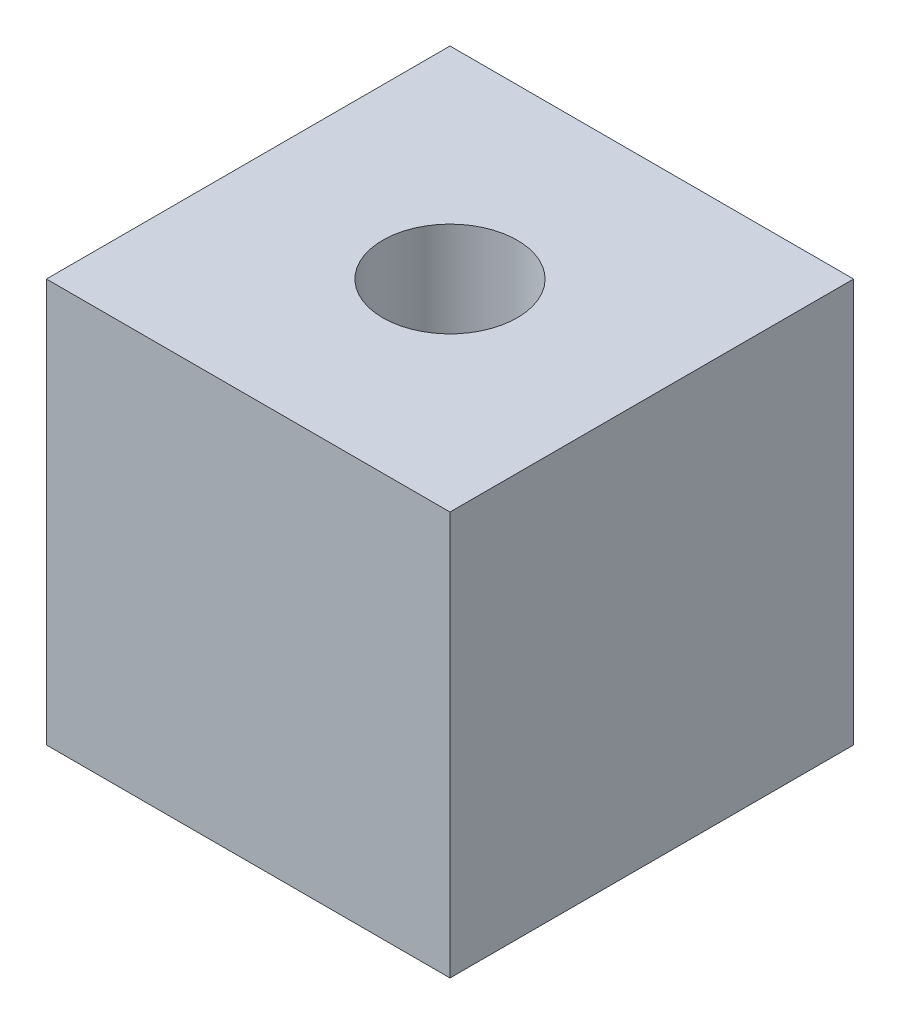
ISO-10303-21;
HEADER;
FILE_DESCRIPTION(('STEP AP214'),'2;1');
FILE_NAME('part.step','',(''),(''),'','','');
FILE_SCHEMA(('AUTOMOTIVE_DESIGN { 1 0 10303 214 1 1 1 1 }'));
ENDSEC;
DATA;
#1=APPLICATION_CONTEXT('core data for automotive mechanical design processes');
#2=APPLICATION_PROTOCOL_DEFINITION('international standard','automotive_design',2000,#1);
#3=PRODUCT_CONTEXT('',#1,'mechanical');
#4=PRODUCT('Part','Part','',(#3));
#5=PRODUCT_RELATED_PRODUCT_CATEGORY('part','',(#4));
#6=PRODUCT_DEFINITION_FORMATION('','',#4);
#7=PRODUCT_DEFINITION_CONTEXT('part definition',#1,'design');
#8=PRODUCT_DEFINITION('design','',#6,#7);
#9=PRODUCT_DEFINITION_SHAPE('','',#8);
#10=(LENGTH_UNIT() NAMED_UNIT(*) SI_UNIT(.MILLI.,.METRE.));
#11=(NAMED_UNIT(*) PLANE_ANGLE_UNIT() SI_UNIT($,.RADIAN.));
#12=(NAMED_UNIT(*) SI_UNIT($,.STERADIAN.) SOLID_ANGLE_UNIT());
#13=UNCERTAINTY_MEASURE_WITH_UNIT(LENGTH_MEASURE(1.E-05),#10,'distance_accuracy_value','');
#14=(GEOMETRIC_REPRESENTATION_CONTEXT(3) GLOBAL_UNCERTAINTY_ASSIGNED_CONTEXT((#13)) GLOBAL_UNIT_ASSIGNED_CONTEXT((#10,
#11,#12)) REPRESENTATION_CONTEXT('',''));
#15=CARTESIAN_POINT('',(0.,0.,0.));
#16=DIRECTION('',(0.,0.,1.));
#17=DIRECTION('',(1.,0.,0.));
#18=AXIS2_PLACEMENT_3D('',#15,#16,#17);
#19=CARTESIAN_POINT('',(0.,12.,0.));
#20=DIRECTION('',(0.,1.,0.));
#21=DIRECTION('',(0.,0.,1.));
#22=AXIS2_PLACEMENT_3D('',#19,#20,#21);
#23=PLANE('',#22);
#24=DIRECTION('',(0.,0.,1.));
#25=VECTOR('',#24,1.);
#26=CARTESIAN_POINT('',(0.,12.,0.));
#27=LINE('',#26,#25);
#28=CARTESIAN_POINT('',(0.,12.,0.));
#29=VERTEX_POINT('',#28);
#30=CARTESIAN_POINT('',(0.,12.,12.));
#31=VERTEX_POINT('',#30);
#32=EDGE_CURVE('E85',#29,#31,#27,.T.);
#33=ORIENTED_EDGE('',*,*,#32,.T.);
#34=DIRECTION('',(1.,0.,0.));
#35=VECTOR('',#34,1.);
#36=CARTESIAN_POINT('',(0.,12.,12.));
#37=LINE('',#36,#35);
#38=CARTESIAN_POINT('',(12.,12.,12.));
#39=VERTEX_POINT('',#38);
#40=EDGE_CURVE('E80',#31,#39,#37,.T.);
#41=ORIENTED_EDGE('',*,*,#40,.T.);
#42=DIRECTION('',(0.,0.,-1.));
#43=VECTOR('',#42,1.);
#44=CARTESIAN_POINT('',(12.,12.,0.));
#45=LINE('',#44,#43);
#46=CARTESIAN_POINT('',(12.,12.,0.));
#47=VERTEX_POINT('',#46);
#48=EDGE_CURVE('E83',#39,#47,#45,.T.);
#49=ORIENTED_EDGE('',*,*,#48,.T.);
#50=DIRECTION('',(-1.,0.,0.));
#51=VECTOR('',#50,1.);
#52=CARTESIAN_POINT('',(0.,12.,0.));
#53=LINE('',#52,#51);
#54=EDGE_CURVE('E50',#47,#29,#53,.T.);
#55=ORIENTED_EDGE('',*,*,#54,.T.);
#56=EDGE_LOOP('',(#33,#41,#49,#55));
#57=FACE_BOUND('',#56,.T.);
#58=CARTESIAN_POINT('',(6.,12.,6.));
#59=DIRECTION('',(0.,1.,0.));
#60=DIRECTION('',(0.,0.,1.));
#61=AXIS2_PLACEMENT_3D('',#58,#59,#60);
#62=CIRCLE('',#61,2.);
#63=CARTESIAN_POINT('',(6.,12.,8.));
#64=VERTEX_POINT('',#63);
#65=EDGE_CURVE('E100',#64,#64,#62,.T.);
#66=ORIENTED_EDGE('',*,*,#65,.F.);
#67=EDGE_LOOP('',(#66));
#68=FACE_BOUND('',#67,.T.);
#69=ADVANCED_FACE('F33',(#57,#68),#23,.T.);
#70=CARTESIAN_POINT('',(0.,0.,0.));
#71=DIRECTION('',(0.,1.,0.));
#72=DIRECTION('',(0.,0.,1.));
#73=AXIS2_PLACEMENT_3D('',#70,#71,#72);
#74=PLANE('',#73);
#75=DIRECTION('',(0.,0.,1.));
#76=VECTOR('',#75,1.);
#77=CARTESIAN_POINT('',(0.,0.,0.));
#78=LINE('',#77,#76);
#79=CARTESIAN_POINT('',(0.,0.,0.));
#80=VERTEX_POINT('',#79);
#81=CARTESIAN_POINT('',(0.,0.,12.));
#82=VERTEX_POINT('',#81);
#83=EDGE_CURVE('E97',#80,#82,#78,.T.);
#84=ORIENTED_EDGE('',*,*,#83,.F.);
#85=DIRECTION('',(-1.,0.,0.));
#86=VECTOR('',#85,1.);
#87=CARTESIAN_POINT('',(0.,0.,0.));
#88=LINE('',#87,#86);
#89=CARTESIAN_POINT('',(12.,0.,0.));
#90=VERTEX_POINT('',#89);
#91=EDGE_CURVE('E73',#90,#80,#88,.T.);
#92=ORIENTED_EDGE('',*,*,#91,.F.);
#93=DIRECTION('',(0.,0.,-1.));
#94=VECTOR('',#93,1.);
#95=CARTESIAN_POINT('',(12.,0.,0.));
#96=LINE('',#95,#94);
#97=CARTESIAN_POINT('',(12.,0.,12.));
#98=VERTEX_POINT('',#97);
#99=EDGE_CURVE('E67',#98,#90,#96,.T.);
#100=ORIENTED_EDGE('',*,*,#99,.F.);
#101=DIRECTION('',(1.,0.,0.));
#102=VECTOR('',#101,1.);
#103=CARTESIAN_POINT('',(0.,0.,12.));
#104=LINE('',#103,#102);
#105=EDGE_CURVE('E89',#82,#98,#104,.T.);
#106=ORIENTED_EDGE('',*,*,#105,.F.);
#107=EDGE_LOOP('',(#84,#92,#100,#106));
#108=FACE_BOUND('',#107,.T.);
#109=CARTESIAN_POINT('',(6.,0.,6.));
#110=DIRECTION('',(0.,1.,0.));
#111=DIRECTION('',(0.,0.,1.));
#112=AXIS2_PLACEMENT_3D('',#109,#110,#111);
#113=CIRCLE('',#112,2.);
#114=CARTESIAN_POINT('',(6.,0.,8.));
#115=VERTEX_POINT('',#114);
#116=EDGE_CURVE('E112',#115,#115,#113,.T.);
#117=ORIENTED_EDGE('',*,*,#116,.T.);
#118=EDGE_LOOP('',(#117));
#119=FACE_BOUND('',#118,.T.);
#120=ADVANCED_FACE('F108',(#108,#119),#74,.F.);
#121=CARTESIAN_POINT('',(0.,12.,0.));
#122=DIRECTION('',(1.,0.,0.));
#123=DIRECTION('',(0.,0.,-1.));
#124=AXIS2_PLACEMENT_3D('',#121,#122,#123);
#125=PLANE('',#124);
#126=ORIENTED_EDGE('',*,*,#83,.T.);
#127=DIRECTION('',(0.,-1.,0.));
#128=VECTOR('',#127,1.);
#129=CARTESIAN_POINT('',(0.,12.,12.));
#130=LINE('',#129,#128);
#131=EDGE_CURVE('E11',#31,#82,#130,.T.);
#132=ORIENTED_EDGE('',*,*,#131,.F.);
#133=ORIENTED_EDGE('',*,*,#32,.F.);
#134=DIRECTION('',(0.,-1.,0.));
#135=VECTOR('',#134,1.);
#136=CARTESIAN_POINT('',(0.,12.,0.));
#137=LINE('',#136,#135);
#138=EDGE_CURVE('E93',#29,#80,#137,.T.);
#139=ORIENTED_EDGE('',*,*,#138,.T.);
#140=EDGE_LOOP('',(#126,#132,#133,#139));
#141=FACE_BOUND('',#140,.T.);
#142=ADVANCED_FACE('F35',(#141),#125,.F.);
#143=CARTESIAN_POINT('',(0.,12.,12.));
#144=DIRECTION('',(0.,0.,-1.));
#145=DIRECTION('',(-1.,0.,0.));
#146=AXIS2_PLACEMENT_3D('',#143,#144,#145);
#147=PLANE('',#146);
#148=ORIENTED_EDGE('',*,*,#105,.T.);
#149=DIRECTION('',(0.,-1.,0.));
#150=VECTOR('',#149,1.);
#151=CARTESIAN_POINT('',(12.,12.,12.));
#152=LINE('',#151,#150);
#153=EDGE_CURVE('E42',#39,#98,#152,.T.);
#154=ORIENTED_EDGE('',*,*,#153,.F.);
#155=ORIENTED_EDGE('',*,*,#40,.F.);
#156=ORIENTED_EDGE('',*,*,#131,.T.);
#157=EDGE_LOOP('',(#148,#154,#155,#156));
#158=FACE_BOUND('',#157,.T.);
#159=ADVANCED_FACE('F88',(#158),#147,.F.);
#160=CARTESIAN_POINT('',(12.,12.,0.));
#161=DIRECTION('',(-1.,0.,0.));
#162=DIRECTION('',(0.,0.,1.));
#163=AXIS2_PLACEMENT_3D('',#160,#161,#162);
#164=PLANE('',#163);
#165=ORIENTED_EDGE('',*,*,#99,.T.);
#166=DIRECTION('',(0.,-1.,0.));
#167=VECTOR('',#166,1.);
#168=CARTESIAN_POINT('',(12.,12.,0.));
#169=LINE('',#168,#167);
#170=EDGE_CURVE('E90',#47,#90,#169,.T.);
#171=ORIENTED_EDGE('',*,*,#170,.F.);
#172=ORIENTED_EDGE('',*,*,#48,.F.);
#173=ORIENTED_EDGE('',*,*,#153,.T.);
#174=EDGE_LOOP('',(#165,#171,#172,#173));
#175=FACE_BOUND('',#174,.T.);
#176=ADVANCED_FACE('F91',(#175),#164,.F.);
#177=CARTESIAN_POINT('',(0.,12.,0.));
#178=DIRECTION('',(0.,0.,1.));
#179=DIRECTION('',(1.,0.,0.));
#180=AXIS2_PLACEMENT_3D('',#177,#178,#179);
#181=PLANE('',#180);
#182=ORIENTED_EDGE('',*,*,#91,.T.);
#183=ORIENTED_EDGE('',*,*,#138,.F.);
#184=ORIENTED_EDGE('',*,*,#54,.F.);
#185=ORIENTED_EDGE('',*,*,#170,.T.);
#186=EDGE_LOOP('',(#182,#183,#184,#185));
#187=FACE_BOUND('',#186,.T.);
#188=ADVANCED_FACE('F105',(#187),#181,.F.);
#189=CARTESIAN_POINT('',(6.,12.,6.));
#190=DIRECTION('',(0.,-1.,0.));
#191=DIRECTION('',(0.,0.,-1.));
#192=AXIS2_PLACEMENT_3D('',#189,#190,#191);
#193=CYLINDRICAL_SURFACE('',#192,2.);
#194=ORIENTED_EDGE('',*,*,#65,.T.);
#195=EDGE_LOOP('',(#194));
#196=FACE_BOUND('',#195,.T.);
#197=ORIENTED_EDGE('',*,*,#116,.F.);
#198=EDGE_LOOP('',(#197));
#199=FACE_BOUND('',#198,.T.);
#200=ADVANCED_FACE('F118',(#196,#199),#193,.F.);
#201=CLOSED_SHELL('',(#69,#120,#142,#159,#176,#188,#200));
#202=MANIFOLD_SOLID_BREP('B2',#201);
#203=ADVANCED_BREP_SHAPE_REPRESENTATION('',(#18,#202),#14);
#204=SHAPE_DEFINITION_REPRESENTATION(#9,#203);
ENDSEC;
END-ISO-10303-21;
